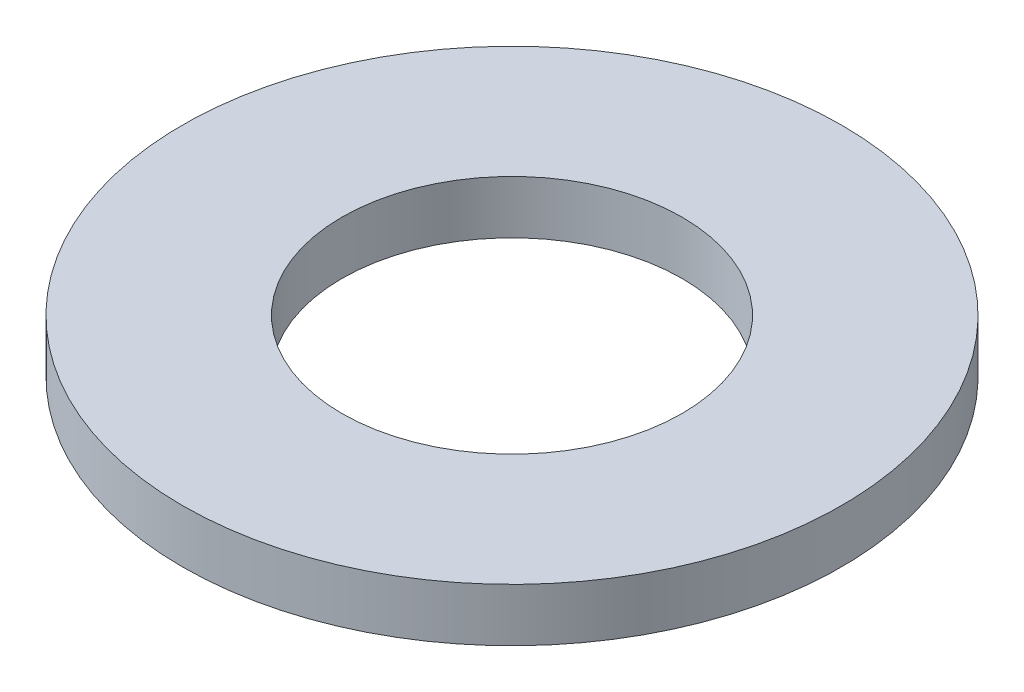
ISO-10303-21;
HEADER;
FILE_DESCRIPTION(('STEP AP214'),'2;1');
FILE_NAME('part.step','',(''),(''),'','','');
FILE_SCHEMA(('AUTOMOTIVE_DESIGN { 1 0 10303 214 1 1 1 1 }'));
ENDSEC;
DATA;
#1=APPLICATION_CONTEXT('core data for automotive mechanical design processes');
#2=APPLICATION_PROTOCOL_DEFINITION('international standard','automotive_design',2000,#1);
#3=PRODUCT_CONTEXT('',#1,'mechanical');
#4=PRODUCT('Part','Part','',(#3));
#5=PRODUCT_RELATED_PRODUCT_CATEGORY('part','',(#4));
#6=PRODUCT_DEFINITION_FORMATION('','',#4);
#7=PRODUCT_DEFINITION_CONTEXT('part definition',#1,'design');
#8=PRODUCT_DEFINITION('design','',#6,#7);
#9=PRODUCT_DEFINITION_SHAPE('','',#8);
#10=(LENGTH_UNIT() NAMED_UNIT(*) SI_UNIT(.MILLI.,.METRE.));
#11=(NAMED_UNIT(*) PLANE_ANGLE_UNIT() SI_UNIT($,.RADIAN.));
#12=(NAMED_UNIT(*) SI_UNIT($,.STERADIAN.) SOLID_ANGLE_UNIT());
#13=UNCERTAINTY_MEASURE_WITH_UNIT(LENGTH_MEASURE(1.E-05),#10,'distance_accuracy_value','');
#14=(GEOMETRIC_REPRESENTATION_CONTEXT(3) GLOBAL_UNCERTAINTY_ASSIGNED_CONTEXT((#13)) GLOBAL_UNIT_ASSIGNED_CONTEXT((#10,
#11,#12)) REPRESENTATION_CONTEXT('',''));
#15=CARTESIAN_POINT('',(0.,0.,0.));
#16=DIRECTION('',(0.,0.,1.));
#17=DIRECTION('',(1.,0.,0.));
#18=AXIS2_PLACEMENT_3D('',#15,#16,#17);
#19=CARTESIAN_POINT('',(0.,1.,0.));
#20=DIRECTION('',(0.,1.,0.));
#21=DIRECTION('',(0.,0.,1.));
#22=AXIS2_PLACEMENT_3D('',#19,#20,#21);
#23=PLANE('',#22);
#24=CARTESIAN_POINT('',(0.,1.,0.));
#25=DIRECTION('',(0.,1.,0.));
#26=DIRECTION('',(0.,0.,1.));
#27=AXIS2_PLACEMENT_3D('',#24,#25,#26);
#28=CIRCLE('',#27,6.2);
#29=CARTESIAN_POINT('',(0.,1.,6.2));
#30=VERTEX_POINT('',#29);
#31=EDGE_CURVE('E10',#30,#30,#28,.T.);
#32=ORIENTED_EDGE('',*,*,#31,.T.);
#33=EDGE_LOOP('',(#32));
#34=FACE_BOUND('',#33,.T.);
#35=CARTESIAN_POINT('',(0.,1.,0.));
#36=DIRECTION('',(0.,1.,0.));
#37=DIRECTION('',(0.,0.,1.));
#38=AXIS2_PLACEMENT_3D('',#35,#36,#37);
#39=CIRCLE('',#38,3.2);
#40=CARTESIAN_POINT('',(0.,1.,3.2));
#41=VERTEX_POINT('',#40);
#42=EDGE_CURVE('E42',#41,#41,#39,.T.);
#43=ORIENTED_EDGE('',*,*,#42,.F.);
#44=EDGE_LOOP('',(#43));
#45=FACE_BOUND('',#44,.T.);
#46=ADVANCED_FACE('F31',(#34,#45),#23,.T.);
#47=CARTESIAN_POINT('',(0.,0.,0.));
#48=DIRECTION('',(0.,1.,0.));
#49=DIRECTION('',(0.,0.,1.));
#50=AXIS2_PLACEMENT_3D('',#47,#48,#49);
#51=PLANE('',#50);
#52=CARTESIAN_POINT('',(0.,0.,0.));
#53=DIRECTION('',(0.,1.,0.));
#54=DIRECTION('',(0.,0.,1.));
#55=AXIS2_PLACEMENT_3D('',#52,#53,#54);
#56=CIRCLE('',#55,6.2);
#57=CARTESIAN_POINT('',(0.,0.,6.2));
#58=VERTEX_POINT('',#57);
#59=EDGE_CURVE('E35',#58,#58,#56,.T.);
#60=ORIENTED_EDGE('',*,*,#59,.F.);
#61=EDGE_LOOP('',(#60));
#62=FACE_BOUND('',#61,.T.);
#63=CARTESIAN_POINT('',(0.,0.,0.));
#64=DIRECTION('',(0.,1.,0.));
#65=DIRECTION('',(0.,0.,1.));
#66=AXIS2_PLACEMENT_3D('',#63,#64,#65);
#67=CIRCLE('',#66,3.2);
#68=CARTESIAN_POINT('',(0.,0.,3.2));
#69=VERTEX_POINT('',#68);
#70=EDGE_CURVE('E44',#69,#69,#67,.T.);
#71=ORIENTED_EDGE('',*,*,#70,.T.);
#72=EDGE_LOOP('',(#71));
#73=FACE_BOUND('',#72,.T.);
#74=ADVANCED_FACE('F54',(#62,#73),#51,.F.);
#75=CARTESIAN_POINT('',(0.,1.,0.));
#76=DIRECTION('',(0.,-1.,0.));
#77=DIRECTION('',(0.,0.,-1.));
#78=AXIS2_PLACEMENT_3D('',#75,#76,#77);
#79=CYLINDRICAL_SURFACE('',#78,6.2);
#80=ORIENTED_EDGE('',*,*,#31,.F.);
#81=EDGE_LOOP('',(#80));
#82=FACE_BOUND('',#81,.T.);
#83=ORIENTED_EDGE('',*,*,#59,.T.);
#84=EDGE_LOOP('',(#83));
#85=FACE_BOUND('',#84,.T.);
#86=ADVANCED_FACE('F33',(#82,#85),#79,.T.);
#87=CARTESIAN_POINT('',(0.,1.,0.));
#88=DIRECTION('',(0.,-1.,0.));
#89=DIRECTION('',(0.,0.,-1.));
#90=AXIS2_PLACEMENT_3D('',#87,#88,#89);
#91=CYLINDRICAL_SURFACE('',#90,3.2);
#92=ORIENTED_EDGE('',*,*,#42,.T.);
#93=EDGE_LOOP('',(#92));
#94=FACE_BOUND('',#93,.T.);
#95=ORIENTED_EDGE('',*,*,#70,.F.);
#96=EDGE_LOOP('',(#95));
#97=FACE_BOUND('',#96,.T.);
#98=ADVANCED_FACE('F50',(#94,#97),#91,.F.);
#99=CLOSED_SHELL('',(#46,#74,#86,#98));
#100=MANIFOLD_SOLID_BREP('B2',#99);
#101=ADVANCED_BREP_SHAPE_REPRESENTATION('',(#18,#100),#14);
#102=SHAPE_DEFINITION_REPRESENTATION(#9,#101);
ENDSEC;
END-ISO-10303-21;
